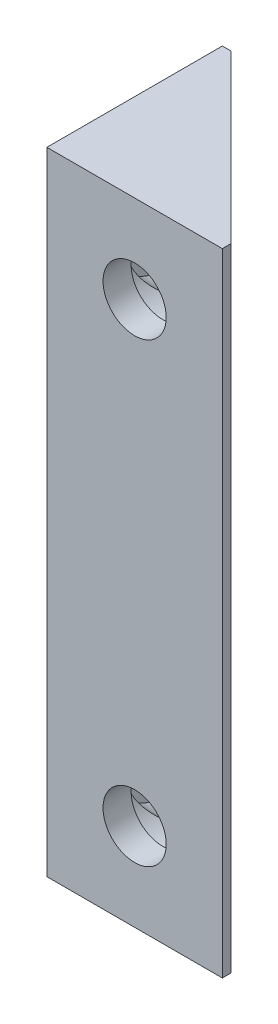
ISO-10303-21;
HEADER;
FILE_DESCRIPTION(('STEP AP214'),'2;1');
FILE_NAME('part.step','',(''),(''),'','','');
FILE_SCHEMA(('AUTOMOTIVE_DESIGN { 1 0 10303 214 1 1 1 1 }'));
ENDSEC;
DATA;
#1=APPLICATION_CONTEXT('core data for automotive mechanical design processes');
#2=APPLICATION_PROTOCOL_DEFINITION('international standard','automotive_design',2000,#1);
#3=PRODUCT_CONTEXT('',#1,'mechanical');
#4=PRODUCT('Part','Part','',(#3));
#5=PRODUCT_RELATED_PRODUCT_CATEGORY('part','',(#4));
#6=PRODUCT_DEFINITION_FORMATION('','',#4);
#7=PRODUCT_DEFINITION_CONTEXT('part definition',#1,'design');
#8=PRODUCT_DEFINITION('design','',#6,#7);
#9=PRODUCT_DEFINITION_SHAPE('','',#8);
#10=(LENGTH_UNIT() NAMED_UNIT(*) SI_UNIT(.MILLI.,.METRE.));
#11=(NAMED_UNIT(*) PLANE_ANGLE_UNIT() SI_UNIT($,.RADIAN.));
#12=(NAMED_UNIT(*) SI_UNIT($,.STERADIAN.) SOLID_ANGLE_UNIT());
#13=UNCERTAINTY_MEASURE_WITH_UNIT(LENGTH_MEASURE(1.E-05),#10,'distance_accuracy_value','');
#14=(GEOMETRIC_REPRESENTATION_CONTEXT(3) GLOBAL_UNCERTAINTY_ASSIGNED_CONTEXT((#13)) GLOBAL_UNIT_ASSIGNED_CONTEXT((#10,
#11,#12)) REPRESENTATION_CONTEXT('',''));
#15=CARTESIAN_POINT('',(0.,0.,0.));
#16=DIRECTION('',(0.,0.,1.));
#17=DIRECTION('',(1.,0.,0.));
#18=AXIS2_PLACEMENT_3D('',#15,#16,#17);
#19=CARTESIAN_POINT('',(10.,-26.,-29.778174593052));
#20=DIRECTION('',(0.,0.,1.));
#21=DIRECTION('',(1.,0.,0.));
#22=AXIS2_PLACEMENT_3D('',#19,#20,#21);
#23=CYLINDRICAL_SURFACE('',#22,5.5);
#24=CARTESIAN_POINT('',(10.,-26.,-3.2));
#25=DIRECTION('',(0.,0.,1.));
#26=DIRECTION('',(-1.,0.,0.));
#27=AXIS2_PLACEMENT_3D('',#24,#25,#26);
#28=CIRCLE('',#27,5.5);
#29=CARTESIAN_POINT('',(4.5,-26.,-3.2));
#30=VERTEX_POINT('',#29);
#31=EDGE_CURVE('E149',#30,#30,#28,.T.);
#32=ORIENTED_EDGE('',*,*,#31,.T.);
#33=EDGE_LOOP('',(#32));
#34=FACE_BOUND('',#33,.T.);
#35=CARTESIAN_POINT('',(10.,-26.,-10.));
#36=DIRECTION('',(0.707106781186547,0.,0.707106781186547));
#37=DIRECTION('',(-0.707106781186547,0.,0.707106781186547));
#38=AXIS2_PLACEMENT_3D('',#35,#36,#37);
#39=ELLIPSE('',#38,7.77817459305202,5.5);
#40=CARTESIAN_POINT('',(10.,-31.5,-10.));
#41=VERTEX_POINT('',#40);
#42=CARTESIAN_POINT('',(10.,-20.5,-10.));
#43=VERTEX_POINT('',#42);
#44=EDGE_CURVE('E128',#41,#43,#39,.F.);
#45=ORIENTED_EDGE('',*,*,#44,.T.);
#46=CARTESIAN_POINT('',(10.,-26.,-10.));
#47=DIRECTION('',(-0.707106781186547,0.,0.707106781186547));
#48=DIRECTION('',(0.707106781186547,0.,0.707106781186547));
#49=AXIS2_PLACEMENT_3D('',#46,#47,#48);
#50=ELLIPSE('',#49,7.77817459305202,5.5);
#51=EDGE_CURVE('E288',#43,#41,#50,.F.);
#52=ORIENTED_EDGE('',*,*,#51,.T.);
#53=EDGE_LOOP('',(#45,#52));
#54=FACE_BOUND('',#53,.T.);
#55=ADVANCED_FACE('F41',(#34,#54),#23,.F.);
#56=CARTESIAN_POINT('',(10.,26.,-29.778174593052));
#57=DIRECTION('',(0.,0.,1.));
#58=DIRECTION('',(1.,0.,0.));
#59=AXIS2_PLACEMENT_3D('',#56,#57,#58);
#60=CYLINDRICAL_SURFACE('',#59,5.5);
#61=CARTESIAN_POINT('',(10.,26.,-3.2));
#62=DIRECTION('',(0.,0.,1.));
#63=DIRECTION('',(1.,0.,0.));
#64=AXIS2_PLACEMENT_3D('',#61,#62,#63);
#65=CIRCLE('',#64,5.5);
#66=CARTESIAN_POINT('',(15.5,26.,-3.2));
#67=VERTEX_POINT('',#66);
#68=EDGE_CURVE('E133',#67,#67,#65,.T.);
#69=ORIENTED_EDGE('',*,*,#68,.T.);
#70=EDGE_LOOP('',(#69));
#71=FACE_BOUND('',#70,.T.);
#72=CARTESIAN_POINT('',(10.,26.,-10.));
#73=DIRECTION('',(0.707106781186547,0.,0.707106781186547));
#74=DIRECTION('',(-0.707106781186547,0.,0.707106781186547));
#75=AXIS2_PLACEMENT_3D('',#72,#73,#74);
#76=ELLIPSE('',#75,7.77817459305202,5.5);
#77=CARTESIAN_POINT('',(10.,20.5,-10.));
#78=VERTEX_POINT('',#77);
#79=CARTESIAN_POINT('',(10.,31.5,-10.));
#80=VERTEX_POINT('',#79);
#81=EDGE_CURVE('E62',#78,#80,#76,.F.);
#82=ORIENTED_EDGE('',*,*,#81,.T.);
#83=CARTESIAN_POINT('',(10.,26.,-10.));
#84=DIRECTION('',(-0.707106781186547,0.,0.707106781186547));
#85=DIRECTION('',(0.707106781186547,0.,0.707106781186547));
#86=AXIS2_PLACEMENT_3D('',#83,#84,#85);
#87=ELLIPSE('',#86,7.77817459305202,5.5);
#88=EDGE_CURVE('E11',#80,#78,#87,.F.);
#89=ORIENTED_EDGE('',*,*,#88,.T.);
#90=EDGE_LOOP('',(#82,#89));
#91=FACE_BOUND('',#90,.T.);
#92=ADVANCED_FACE('F197',(#71,#91),#60,.F.);
#93=CARTESIAN_POINT('',(23.2911688245431,-26.,-10.));
#94=DIRECTION('',(-1.,0.,0.));
#95=DIRECTION('',(0.,0.,1.));
#96=AXIS2_PLACEMENT_3D('',#93,#94,#95);
#97=CYLINDRICAL_SURFACE('',#96,3.6);
#98=CARTESIAN_POINT('',(0.,-26.,-10.));
#99=DIRECTION('',(-1.,0.,0.));
#100=DIRECTION('',(0.,0.,1.));
#101=AXIS2_PLACEMENT_3D('',#98,#99,#100);
#102=CIRCLE('',#101,3.6);
#103=CARTESIAN_POINT('',(0.,-26.,-6.4));
#104=VERTEX_POINT('',#103);
#105=EDGE_CURVE('E143',#104,#104,#102,.F.);
#106=CARTESIAN_POINT('',(3.2,-26.,-10.));
#107=DIRECTION('',(-1.,0.,0.));
#108=DIRECTION('',(0.,0.,-1.));
#109=AXIS2_PLACEMENT_3D('',#106,#107,#108);
#110=CIRCLE('',#109,3.6);
#111=CARTESIAN_POINT('',(3.2,-26.,-6.4));
#112=VERTEX_POINT('',#111);
#113=EDGE_CURVE('E309',#112,#112,#110,.T.);
#114=CARTESIAN_POINT('',(0.,-26.,-6.4));
#115=CARTESIAN_POINT('',(0.0333333333333366,-26.,-6.4));
#116=CARTESIAN_POINT('',(0.0666666666666697,-26.,-6.4));
#117=CARTESIAN_POINT('',(0.133333333333336,-26.,-6.4));
#118=CARTESIAN_POINT('',(0.166666666666669,-26.,-6.4));
#119=CARTESIAN_POINT('',(0.233333333333335,-26.,-6.4));
#120=CARTESIAN_POINT('',(0.266666666666668,-26.,-6.4));
#121=CARTESIAN_POINT('',(0.333333333333335,-26.,-6.4));
#122=CARTESIAN_POINT('',(0.366666666666668,-26.,-6.4));
#123=CARTESIAN_POINT('',(0.433333333333335,-26.,-6.4));
#124=CARTESIAN_POINT('',(0.46666666666667,-26.,-6.4));
#125=CARTESIAN_POINT('',(0.533333333333337,-26.,-6.4));
#126=CARTESIAN_POINT('',(0.56666666666667,-26.,-6.4));
#127=CARTESIAN_POINT('',(0.633333333333336,-26.,-6.4));
#128=CARTESIAN_POINT('',(0.66666666666667,-26.,-6.4));
#129=CARTESIAN_POINT('',(0.733333333333336,-26.,-6.4));
#130=CARTESIAN_POINT('',(0.766666666666669,-26.,-6.4));
#131=CARTESIAN_POINT('',(0.833333333333335,-26.,-6.4));
#132=CARTESIAN_POINT('',(0.866666666666668,-26.,-6.4));
#133=CARTESIAN_POINT('',(0.933333333333335,-26.,-6.4));
#134=CARTESIAN_POINT('',(0.966666666666668,-26.,-6.4));
#135=CARTESIAN_POINT('',(1.03333333333333,-26.,-6.4));
#136=CARTESIAN_POINT('',(1.06666666666667,-26.,-6.4));
#137=CARTESIAN_POINT('',(1.13333333333333,-26.,-6.4));
#138=CARTESIAN_POINT('',(1.16666666666667,-26.,-6.4));
#139=CARTESIAN_POINT('',(1.23333333333334,-26.,-6.4));
#140=CARTESIAN_POINT('',(1.26666666666667,-26.,-6.4));
#141=CARTESIAN_POINT('',(1.33333333333334,-26.,-6.4));
#142=CARTESIAN_POINT('',(1.36666666666667,-26.,-6.4));
#143=CARTESIAN_POINT('',(1.43333333333334,-26.,-6.4));
#144=CARTESIAN_POINT('',(1.46666666666667,-26.,-6.4));
#145=CARTESIAN_POINT('',(1.53333333333333,-26.,-6.4));
#146=CARTESIAN_POINT('',(1.56666666666667,-26.,-6.4));
#147=CARTESIAN_POINT('',(1.63333333333333,-26.,-6.4));
#148=CARTESIAN_POINT('',(1.66666666666667,-26.,-6.4));
#149=CARTESIAN_POINT('',(1.73333333333333,-26.,-6.4));
#150=CARTESIAN_POINT('',(1.76666666666667,-26.,-6.4));
#151=CARTESIAN_POINT('',(1.83333333333333,-26.,-6.4));
#152=CARTESIAN_POINT('',(1.86666666666667,-26.,-6.4));
#153=CARTESIAN_POINT('',(1.93333333333333,-26.,-6.4));
#154=CARTESIAN_POINT('',(1.96666666666667,-26.,-6.4));
#155=CARTESIAN_POINT('',(2.03333333333333,-26.,-6.4));
#156=CARTESIAN_POINT('',(2.06666666666667,-26.,-6.4));
#157=CARTESIAN_POINT('',(2.13333333333333,-26.,-6.4));
#158=CARTESIAN_POINT('',(2.16666666666667,-26.,-6.4));
#159=CARTESIAN_POINT('',(2.23333333333333,-26.,-6.4));
#160=CARTESIAN_POINT('',(2.26666666666667,-26.,-6.4));
#161=CARTESIAN_POINT('',(2.33333333333333,-26.,-6.4));
#162=CARTESIAN_POINT('',(2.36666666666667,-26.,-6.4));
#163=CARTESIAN_POINT('',(2.43333333333333,-26.,-6.4));
#164=CARTESIAN_POINT('',(2.46666666666667,-26.,-6.4));
#165=CARTESIAN_POINT('',(2.53333333333333,-26.,-6.4));
#166=CARTESIAN_POINT('',(2.56666666666667,-26.,-6.4));
#167=CARTESIAN_POINT('',(2.63333333333333,-26.,-6.4));
#168=CARTESIAN_POINT('',(2.66666666666666,-26.,-6.4));
#169=CARTESIAN_POINT('',(2.73333333333333,-26.,-6.4));
#170=CARTESIAN_POINT('',(2.76666666666667,-26.,-6.4));
#171=CARTESIAN_POINT('',(2.83333333333333,-26.,-6.4));
#172=CARTESIAN_POINT('',(2.86666666666667,-26.,-6.4));
#173=CARTESIAN_POINT('',(2.93333333333333,-26.,-6.4));
#174=CARTESIAN_POINT('',(2.96666666666667,-26.,-6.4));
#175=CARTESIAN_POINT('',(3.03333333333333,-26.,-6.4));
#176=CARTESIAN_POINT('',(3.06666666666667,-26.,-6.4));
#177=CARTESIAN_POINT('',(3.13333333333333,-26.,-6.4));
#178=CARTESIAN_POINT('',(3.16666666666666,-26.,-6.4));
#179=CARTESIAN_POINT('',(3.2,-26.,-6.4));
#180=B_SPLINE_CURVE_WITH_KNOTS('',3,(#114,#115,#116,#117,#118,#119,#120,#121,#122,#123,#124,
#125,#126,#127,#128,#129,#130,#131,#132,#133,#134,#135,#136,#137,#138,#139,#140,#141,#142,#143,
#144,#145,#146,#147,#148,#149,#150,#151,#152,#153,#154,#155,#156,#157,#158,#159,#160,#161,#162,
#163,#164,#165,#166,#167,#168,#169,#170,#171,#172,#173,#174,#175,#176,#177,#178,#179),
.UNSPECIFIED.,.F.,.F.,(4,2,2,2,2,2,2,2,2,2,2,2,2,2,2,2,2,2,2,2,2,2,2,2,2,2,2,2,2,2,2,2,4),(0.,
0.0999999999999994,0.199999999999999,0.299999999999998,0.399999999999998,0.5,0.6,
0.699999999999999,0.799999999999999,0.899999999999998,0.999999999999997,1.1,1.2,1.3,1.4,1.5,1.6,
1.7,1.8,1.9,1.99999999999999,2.1,2.2,2.3,2.4,2.5,2.59999999999999,2.69999999999999,2.8,2.9,3.,
3.1,3.19999999999999),.UNSPECIFIED.);
#181=EDGE_CURVE('BSEAM199',#104,#112,#180,.T.);
#182=ORIENTED_EDGE('',*,*,#105,.F.);
#183=ORIENTED_EDGE('',*,*,#113,.F.);
#184=ORIENTED_EDGE('',*,*,#181,.T.);
#185=ORIENTED_EDGE('',*,*,#181,.F.);
#186=EDGE_LOOP('',(#182,#184,#183,#185));
#187=FACE_BOUND('',#186,.T.);
#188=ADVANCED_FACE('F199',(#187),#97,.F.);
#189=CARTESIAN_POINT('',(0.,36.,0.));
#190=DIRECTION('',(1.,0.,0.));
#191=DIRECTION('',(0.,0.,-1.));
#192=AXIS2_PLACEMENT_3D('',#189,#190,#191);
#193=PLANE('',#192);
#194=DIRECTION('',(0.,0.,1.));
#195=VECTOR('',#194,1.);
#196=CARTESIAN_POINT('',(0.,-36.,0.));
#197=LINE('',#196,#195);
#198=CARTESIAN_POINT('',(0.,-36.,-20.));
#199=VERTEX_POINT('',#198);
#200=CARTESIAN_POINT('',(0.,-36.,0.));
#201=VERTEX_POINT('',#200);
#202=EDGE_CURVE('E163',#199,#201,#197,.T.);
#203=ORIENTED_EDGE('',*,*,#202,.T.);
#204=DIRECTION('',(0.,-1.,0.));
#205=VECTOR('',#204,1.);
#206=CARTESIAN_POINT('',(0.,36.,0.));
#207=LINE('',#206,#205);
#208=CARTESIAN_POINT('',(0.,36.,0.));
#209=VERTEX_POINT('',#208);
#210=EDGE_CURVE('E171',#209,#201,#207,.T.);
#211=ORIENTED_EDGE('',*,*,#210,.F.);
#212=DIRECTION('',(0.,0.,1.));
#213=VECTOR('',#212,1.);
#214=CARTESIAN_POINT('',(0.,36.,0.));
#215=LINE('',#214,#213);
#216=CARTESIAN_POINT('',(0.,36.,-20.));
#217=VERTEX_POINT('',#216);
#218=EDGE_CURVE('E169',#217,#209,#215,.T.);
#219=ORIENTED_EDGE('',*,*,#218,.F.);
#220=DIRECTION('',(0.,-1.,0.));
#221=VECTOR('',#220,1.);
#222=CARTESIAN_POINT('',(0.,36.,-20.));
#223=LINE('',#222,#221);
#224=EDGE_CURVE('E183',#217,#199,#223,.T.);
#225=ORIENTED_EDGE('',*,*,#224,.T.);
#226=EDGE_LOOP('',(#203,#211,#219,#225));
#227=FACE_BOUND('',#226,.T.);
#228=ORIENTED_EDGE('',*,*,#105,.T.);
#229=EDGE_LOOP('',(#228));
#230=FACE_BOUND('',#229,.T.);
#231=CARTESIAN_POINT('',(0.,26.,-10.));
#232=DIRECTION('',(-1.,0.,0.));
#233=DIRECTION('',(0.,0.,1.));
#234=AXIS2_PLACEMENT_3D('',#231,#232,#233);
#235=CIRCLE('',#234,3.6);
#236=CARTESIAN_POINT('',(0.,26.,-6.4));
#237=VERTEX_POINT('',#236);
#238=EDGE_CURVE('E153',#237,#237,#235,.T.);
#239=ORIENTED_EDGE('',*,*,#238,.F.);
#240=EDGE_LOOP('',(#239));
#241=FACE_BOUND('',#240,.T.);
#242=ADVANCED_FACE('F206',(#227,#230,#241),#193,.F.);
#243=CARTESIAN_POINT('',(10.,-26.,-10.));
#244=DIRECTION('',(0.707106781186547,0.,0.707106781186547));
#245=DIRECTION('',(-0.707106781186547,0.,0.707106781186547));
#246=AXIS2_PLACEMENT_3D('',#243,#244,#245);
#247=ELLIPSE('',#246,7.77817459305202,5.5);
#248=CARTESIAN_POINT('',(10.5,-20.5227744249483,-10.5));
#249=VERTEX_POINT('',#248);
#250=EDGE_CURVE('E56',#249,#43,#247,.T.);
#251=ORIENTED_EDGE('',*,*,#250,.T.);
#252=CARTESIAN_POINT('',(10.,-26.,-10.));
#253=DIRECTION('',(-0.707106781186547,0.,0.707106781186547));
#254=DIRECTION('',(0.707106781186547,0.,0.707106781186547));
#255=AXIS2_PLACEMENT_3D('',#252,#253,#254);
#256=ELLIPSE('',#255,7.77817459305202,5.5);
#257=EDGE_CURVE('E298',#43,#41,#256,.T.);
#258=ORIENTED_EDGE('',*,*,#257,.T.);
#259=CARTESIAN_POINT('',(10.5,-31.4772255750517,-10.5));
#260=VERTEX_POINT('',#259);
#261=EDGE_CURVE('E292',#41,#260,#247,.T.);
#262=ORIENTED_EDGE('',*,*,#261,.T.);
#263=CARTESIAN_POINT('',(10.,-26.,-11.));
#264=DIRECTION('',(-0.707106781186547,0.,0.707106781186547));
#265=DIRECTION('',(0.707106781186548,0.,0.707106781186548));
#266=AXIS2_PLACEMENT_3D('',#263,#264,#265);
#267=ELLIPSE('',#266,7.77817459305202,5.5);
#268=EDGE_CURVE('E146',#260,#249,#267,.F.);
#269=ORIENTED_EDGE('',*,*,#268,.T.);
#270=EDGE_LOOP('',(#251,#258,#262,#269));
#271=FACE_BOUND('',#270,.T.);
#272=ADVANCED_FACE('F211',(#271),#23,.F.);
#273=CARTESIAN_POINT('',(10.,-26.,-23.2911688245431));
#274=DIRECTION('',(0.,0.,1.));
#275=DIRECTION('',(1.,0.,0.));
#276=AXIS2_PLACEMENT_3D('',#273,#274,#275);
#277=CYLINDRICAL_SURFACE('',#276,3.6);
#278=CARTESIAN_POINT('',(10.,-26.,0.));
#279=DIRECTION('',(0.,0.,-1.));
#280=DIRECTION('',(-1.,0.,0.));
#281=AXIS2_PLACEMENT_3D('',#278,#279,#280);
#282=CIRCLE('',#281,3.6);
#283=CARTESIAN_POINT('',(6.4,-26.,0.));
#284=VERTEX_POINT('',#283);
#285=EDGE_CURVE('E132',#284,#284,#282,.T.);
#286=ORIENTED_EDGE('',*,*,#285,.F.);
#287=EDGE_LOOP('',(#286));
#288=FACE_BOUND('',#287,.T.);
#289=CARTESIAN_POINT('',(10.,-26.,-3.2));
#290=DIRECTION('',(0.,0.,1.));
#291=DIRECTION('',(-1.,0.,0.));
#292=AXIS2_PLACEMENT_3D('',#289,#290,#291);
#293=CIRCLE('',#292,3.6);
#294=CARTESIAN_POINT('',(6.4,-26.,-3.2));
#295=VERTEX_POINT('',#294);
#296=EDGE_CURVE('E150',#295,#295,#293,.T.);
#297=ORIENTED_EDGE('',*,*,#296,.F.);
#298=EDGE_LOOP('',(#297));
#299=FACE_BOUND('',#298,.T.);
#300=ADVANCED_FACE('F238',(#288,#299),#277,.F.);
#301=CARTESIAN_POINT('',(20.,36.,0.));
#302=DIRECTION('',(0.,0.,-1.));
#303=DIRECTION('',(-1.,0.,0.));
#304=AXIS2_PLACEMENT_3D('',#301,#302,#303);
#305=PLANE('',#304);
#306=DIRECTION('',(1.,0.,0.));
#307=VECTOR('',#306,1.);
#308=CARTESIAN_POINT('',(20.,-36.,0.));
#309=LINE('',#308,#307);
#310=CARTESIAN_POINT('',(20.,-36.,0.));
#311=VERTEX_POINT('',#310);
#312=EDGE_CURVE('E157',#201,#311,#309,.T.);
#313=ORIENTED_EDGE('',*,*,#312,.T.);
#314=DIRECTION('',(0.,-1.,0.));
#315=VECTOR('',#314,1.);
#316=CARTESIAN_POINT('',(20.,36.,0.));
#317=LINE('',#316,#315);
#318=CARTESIAN_POINT('',(20.,36.,0.));
#319=VERTEX_POINT('',#318);
#320=EDGE_CURVE('E192',#319,#311,#317,.T.);
#321=ORIENTED_EDGE('',*,*,#320,.F.);
#322=DIRECTION('',(1.,0.,0.));
#323=VECTOR('',#322,1.);
#324=CARTESIAN_POINT('',(20.,36.,0.));
#325=LINE('',#324,#323);
#326=EDGE_CURVE('E159',#209,#319,#325,.T.);
#327=ORIENTED_EDGE('',*,*,#326,.F.);
#328=ORIENTED_EDGE('',*,*,#210,.T.);
#329=EDGE_LOOP('',(#313,#321,#327,#328));
#330=FACE_BOUND('',#329,.T.);
#331=ORIENTED_EDGE('',*,*,#285,.T.);
#332=EDGE_LOOP('',(#331));
#333=FACE_BOUND('',#332,.T.);
#334=CARTESIAN_POINT('',(10.,26.,0.));
#335=DIRECTION('',(0.,0.,1.));
#336=DIRECTION('',(1.,0.,0.));
#337=AXIS2_PLACEMENT_3D('',#334,#335,#336);
#338=CIRCLE('',#337,3.6);
#339=CARTESIAN_POINT('',(13.6,26.,0.));
#340=VERTEX_POINT('',#339);
#341=EDGE_CURVE('E136',#340,#340,#338,.T.);
#342=ORIENTED_EDGE('',*,*,#341,.F.);
#343=EDGE_LOOP('',(#342));
#344=FACE_BOUND('',#343,.T.);
#345=ADVANCED_FACE('F43',(#330,#333,#344),#305,.F.);
#346=CARTESIAN_POINT('',(1.,36.,-20.));
#347=DIRECTION('',(-0.707106781186547,0.,0.707106781186547));
#348=DIRECTION('',(0.707106781186548,0.,0.707106781186548));
#349=AXIS2_PLACEMENT_3D('',#346,#347,#348);
#350=PLANE('',#349);
#351=CARTESIAN_POINT('',(10.,26.,-11.));
#352=DIRECTION('',(-0.707106781186547,0.,0.707106781186547));
#353=DIRECTION('',(0.707106781186548,0.,0.707106781186548));
#354=AXIS2_PLACEMENT_3D('',#351,#352,#353);
#355=ELLIPSE('',#354,7.77817459305202,5.5);
#356=CARTESIAN_POINT('',(10.5,20.5227744249483,-10.5));
#357=VERTEX_POINT('',#356);
#358=CARTESIAN_POINT('',(10.5,31.4772255750517,-10.5));
#359=VERTEX_POINT('',#358);
#360=EDGE_CURVE('E127',#357,#359,#355,.F.);
#361=ORIENTED_EDGE('',*,*,#360,.F.);
#362=CARTESIAN_POINT('',(11.,26.,-10.));
#363=DIRECTION('',(-0.707106781186547,0.,0.707106781186547));
#364=DIRECTION('',(-0.707106781186548,0.,-0.707106781186548));
#365=AXIS2_PLACEMENT_3D('',#362,#363,#364);
#366=ELLIPSE('',#365,7.77817459305202,5.5);
#367=EDGE_CURVE('E116',#359,#357,#366,.F.);
#368=ORIENTED_EDGE('',*,*,#367,.F.);
#369=EDGE_LOOP('',(#361,#368));
#370=FACE_BOUND('',#369,.T.);
#371=ORIENTED_EDGE('',*,*,#268,.F.);
#372=CARTESIAN_POINT('',(11.,-26.,-10.));
#373=DIRECTION('',(-0.707106781186547,0.,0.707106781186547));
#374=DIRECTION('',(-0.707106781186548,0.,-0.707106781186548));
#375=AXIS2_PLACEMENT_3D('',#372,#373,#374);
#376=ELLIPSE('',#375,7.77817459305202,5.5);
#377=EDGE_CURVE('E312',#249,#260,#376,.F.);
#378=ORIENTED_EDGE('',*,*,#377,.F.);
#379=EDGE_LOOP('',(#371,#378));
#380=FACE_BOUND('',#379,.T.);
#381=DIRECTION('',(-0.707106781186548,0.,-0.707106781186548));
#382=VECTOR('',#381,1.);
#383=CARTESIAN_POINT('',(1.,-36.,-20.));
#384=LINE('',#383,#382);
#385=CARTESIAN_POINT('',(20.,-36.,-1.));
#386=VERTEX_POINT('',#385);
#387=CARTESIAN_POINT('',(1.,-36.,-20.));
#388=VERTEX_POINT('',#387);
#389=EDGE_CURVE('E176',#386,#388,#384,.T.);
#390=ORIENTED_EDGE('',*,*,#389,.T.);
#391=DIRECTION('',(0.,-1.,0.));
#392=VECTOR('',#391,1.);
#393=CARTESIAN_POINT('',(1.,36.,-20.));
#394=LINE('',#393,#392);
#395=CARTESIAN_POINT('',(1.,36.,-20.));
#396=VERTEX_POINT('',#395);
#397=EDGE_CURVE('E186',#396,#388,#394,.T.);
#398=ORIENTED_EDGE('',*,*,#397,.F.);
#399=DIRECTION('',(-0.707106781186548,0.,-0.707106781186548));
#400=VECTOR('',#399,1.);
#401=CARTESIAN_POINT('',(1.,36.,-20.));
#402=LINE('',#401,#400);
#403=CARTESIAN_POINT('',(20.,36.,-1.));
#404=VERTEX_POINT('',#403);
#405=EDGE_CURVE('E165',#404,#396,#402,.T.);
#406=ORIENTED_EDGE('',*,*,#405,.F.);
#407=DIRECTION('',(0.,-1.,0.));
#408=VECTOR('',#407,1.);
#409=CARTESIAN_POINT('',(20.,36.,-1.));
#410=LINE('',#409,#408);
#411=EDGE_CURVE('E189',#404,#386,#410,.T.);
#412=ORIENTED_EDGE('',*,*,#411,.T.);
#413=EDGE_LOOP('',(#390,#398,#406,#412));
#414=FACE_BOUND('',#413,.T.);
#415=ADVANCED_FACE('F125',(#370,#380,#414),#350,.F.);
#416=CARTESIAN_POINT('',(20.,36.,0.));
#417=DIRECTION('',(-1.,0.,0.));
#418=DIRECTION('',(0.,0.,1.));
#419=AXIS2_PLACEMENT_3D('',#416,#417,#418);
#420=PLANE('',#419);
#421=DIRECTION('',(0.,0.,-1.));
#422=VECTOR('',#421,1.);
#423=CARTESIAN_POINT('',(20.,-36.,0.));
#424=LINE('',#423,#422);
#425=EDGE_CURVE('E174',#311,#386,#424,.T.);
#426=ORIENTED_EDGE('',*,*,#425,.T.);
#427=ORIENTED_EDGE('',*,*,#411,.F.);
#428=DIRECTION('',(0.,0.,-1.));
#429=VECTOR('',#428,1.);
#430=CARTESIAN_POINT('',(20.,36.,0.));
#431=LINE('',#430,#429);
#432=EDGE_CURVE('E162',#319,#404,#431,.T.);
#433=ORIENTED_EDGE('',*,*,#432,.F.);
#434=ORIENTED_EDGE('',*,*,#320,.T.);
#435=EDGE_LOOP('',(#426,#427,#433,#434));
#436=FACE_BOUND('',#435,.T.);
#437=ADVANCED_FACE('F250',(#436),#420,.F.);
#438=CARTESIAN_POINT('',(0.,36.,-20.));
#439=DIRECTION('',(0.,0.,1.));
#440=DIRECTION('',(1.,0.,0.));
#441=AXIS2_PLACEMENT_3D('',#438,#439,#440);
#442=PLANE('',#441);
#443=DIRECTION('',(-1.,0.,0.));
#444=VECTOR('',#443,1.);
#445=CARTESIAN_POINT('',(0.,-36.,-20.));
#446=LINE('',#445,#444);
#447=EDGE_CURVE('E178',#388,#199,#446,.T.);
#448=ORIENTED_EDGE('',*,*,#447,.T.);
#449=ORIENTED_EDGE('',*,*,#224,.F.);
#450=DIRECTION('',(-1.,0.,0.));
#451=VECTOR('',#450,1.);
#452=CARTESIAN_POINT('',(0.,36.,-20.));
#453=LINE('',#452,#451);
#454=EDGE_CURVE('E167',#396,#217,#453,.T.);
#455=ORIENTED_EDGE('',*,*,#454,.F.);
#456=ORIENTED_EDGE('',*,*,#397,.T.);
#457=EDGE_LOOP('',(#448,#449,#455,#456));
#458=FACE_BOUND('',#457,.T.);
#459=ADVANCED_FACE('F242',(#458),#442,.F.);
#460=CARTESIAN_POINT('',(0.,36.,0.));
#461=DIRECTION('',(0.,-1.,0.));
#462=DIRECTION('',(0.,0.,-1.));
#463=AXIS2_PLACEMENT_3D('',#460,#461,#462);
#464=PLANE('',#463);
#465=ORIENTED_EDGE('',*,*,#326,.T.);
#466=ORIENTED_EDGE('',*,*,#432,.T.);
#467=ORIENTED_EDGE('',*,*,#405,.T.);
#468=ORIENTED_EDGE('',*,*,#454,.T.);
#469=ORIENTED_EDGE('',*,*,#218,.T.);
#470=EDGE_LOOP('',(#465,#466,#467,#468,#469));
#471=FACE_BOUND('',#470,.T.);
#472=ADVANCED_FACE('F232',(#471),#464,.F.);
#473=CARTESIAN_POINT('',(0.,-36.,0.));
#474=DIRECTION('',(0.,-1.,0.));
#475=DIRECTION('',(0.,0.,-1.));
#476=AXIS2_PLACEMENT_3D('',#473,#474,#475);
#477=PLANE('',#476);
#478=ORIENTED_EDGE('',*,*,#312,.F.);
#479=ORIENTED_EDGE('',*,*,#202,.F.);
#480=ORIENTED_EDGE('',*,*,#447,.F.);
#481=ORIENTED_EDGE('',*,*,#389,.F.);
#482=ORIENTED_EDGE('',*,*,#425,.F.);
#483=EDGE_LOOP('',(#478,#479,#480,#481,#482));
#484=FACE_BOUND('',#483,.T.);
#485=ADVANCED_FACE('F225',(#484),#477,.T.);
#486=CARTESIAN_POINT('',(10.,26.,-23.2911688245431));
#487=DIRECTION('',(0.,0.,1.));
#488=DIRECTION('',(1.,0.,0.));
#489=AXIS2_PLACEMENT_3D('',#486,#487,#488);
#490=CYLINDRICAL_SURFACE('',#489,3.6);
#491=CARTESIAN_POINT('',(10.,26.,-3.2));
#492=DIRECTION('',(0.,0.,1.));
#493=DIRECTION('',(1.,0.,0.));
#494=AXIS2_PLACEMENT_3D('',#491,#492,#493);
#495=CIRCLE('',#494,3.6);
#496=CARTESIAN_POINT('',(13.6,26.,-3.2));
#497=VERTEX_POINT('',#496);
#498=EDGE_CURVE('E139',#497,#497,#495,.T.);
#499=ORIENTED_EDGE('',*,*,#498,.F.);
#500=EDGE_LOOP('',(#499));
#501=FACE_BOUND('',#500,.T.);
#502=ORIENTED_EDGE('',*,*,#341,.T.);
#503=EDGE_LOOP('',(#502));
#504=FACE_BOUND('',#503,.T.);
#505=ADVANCED_FACE('F216',(#501,#504),#490,.F.);
#506=CARTESIAN_POINT('',(10.,26.,-10.));
#507=DIRECTION('',(0.707106781186547,0.,0.707106781186547));
#508=DIRECTION('',(-0.707106781186547,0.,0.707106781186547));
#509=AXIS2_PLACEMENT_3D('',#506,#507,#508);
#510=ELLIPSE('',#509,7.77817459305202,5.5);
#511=EDGE_CURVE('E113',#359,#80,#510,.T.);
#512=ORIENTED_EDGE('',*,*,#511,.T.);
#513=CARTESIAN_POINT('',(10.,26.,-10.));
#514=DIRECTION('',(-0.707106781186547,0.,0.707106781186547));
#515=DIRECTION('',(0.707106781186547,0.,0.707106781186547));
#516=AXIS2_PLACEMENT_3D('',#513,#514,#515);
#517=ELLIPSE('',#516,7.77817459305202,5.5);
#518=EDGE_CURVE('E49',#80,#78,#517,.T.);
#519=ORIENTED_EDGE('',*,*,#518,.T.);
#520=EDGE_CURVE('E121',#78,#357,#510,.T.);
#521=ORIENTED_EDGE('',*,*,#520,.T.);
#522=ORIENTED_EDGE('',*,*,#360,.T.);
#523=EDGE_LOOP('',(#512,#519,#521,#522));
#524=FACE_BOUND('',#523,.T.);
#525=ADVANCED_FACE('F131',(#524),#60,.F.);
#526=CARTESIAN_POINT('',(10.,26.,-3.2));
#527=DIRECTION('',(0.,0.,1.));
#528=DIRECTION('',(1.,0.,0.));
#529=AXIS2_PLACEMENT_3D('',#526,#527,#528);
#530=PLANE('',#529);
#531=ORIENTED_EDGE('',*,*,#498,.T.);
#532=EDGE_LOOP('',(#531));
#533=FACE_BOUND('',#532,.T.);
#534=ORIENTED_EDGE('',*,*,#68,.F.);
#535=EDGE_LOOP('',(#534));
#536=FACE_BOUND('',#535,.T.);
#537=ADVANCED_FACE('F215',(#533,#536),#530,.F.);
#538=CARTESIAN_POINT('',(10.,-26.,-3.2));
#539=DIRECTION('',(0.,0.,-1.));
#540=DIRECTION('',(-1.,0.,0.));
#541=AXIS2_PLACEMENT_3D('',#538,#539,#540);
#542=PLANE('',#541);
#543=ORIENTED_EDGE('',*,*,#296,.T.);
#544=EDGE_LOOP('',(#543));
#545=FACE_BOUND('',#544,.T.);
#546=ORIENTED_EDGE('',*,*,#31,.F.);
#547=EDGE_LOOP('',(#546));
#548=FACE_BOUND('',#547,.T.);
#549=ADVANCED_FACE('F222',(#545,#548),#542,.T.);
#550=CARTESIAN_POINT('',(23.2911688245431,26.,-10.));
#551=DIRECTION('',(-1.,0.,0.));
#552=DIRECTION('',(0.,0.,1.));
#553=AXIS2_PLACEMENT_3D('',#550,#551,#552);
#554=CYLINDRICAL_SURFACE('',#553,3.6);
#555=CARTESIAN_POINT('',(3.2,26.,-10.));
#556=DIRECTION('',(-1.,0.,0.));
#557=DIRECTION('',(0.,0.,1.));
#558=AXIS2_PLACEMENT_3D('',#555,#556,#557);
#559=CIRCLE('',#558,3.6);
#560=CARTESIAN_POINT('',(3.2,26.,-6.4));
#561=VERTEX_POINT('',#560);
#562=EDGE_CURVE('E315',#561,#561,#559,.T.);
#563=CARTESIAN_POINT('',(3.2,26.,-6.4));
#564=CARTESIAN_POINT('',(3.16666666666666,26.,-6.4));
#565=CARTESIAN_POINT('',(3.13333333333333,26.,-6.4));
#566=CARTESIAN_POINT('',(3.06666666666667,26.,-6.4));
#567=CARTESIAN_POINT('',(3.03333333333333,26.,-6.4));
#568=CARTESIAN_POINT('',(2.96666666666667,26.,-6.4));
#569=CARTESIAN_POINT('',(2.93333333333333,26.,-6.4));
#570=CARTESIAN_POINT('',(2.86666666666667,26.,-6.4));
#571=CARTESIAN_POINT('',(2.83333333333333,26.,-6.4));
#572=CARTESIAN_POINT('',(2.76666666666667,26.,-6.4));
#573=CARTESIAN_POINT('',(2.73333333333333,26.,-6.4));
#574=CARTESIAN_POINT('',(2.66666666666666,26.,-6.4));
#575=CARTESIAN_POINT('',(2.63333333333333,26.,-6.4));
#576=CARTESIAN_POINT('',(2.56666666666667,26.,-6.4));
#577=CARTESIAN_POINT('',(2.53333333333333,26.,-6.4));
#578=CARTESIAN_POINT('',(2.46666666666667,26.,-6.4));
#579=CARTESIAN_POINT('',(2.43333333333333,26.,-6.4));
#580=CARTESIAN_POINT('',(2.36666666666667,26.,-6.4));
#581=CARTESIAN_POINT('',(2.33333333333333,26.,-6.4));
#582=CARTESIAN_POINT('',(2.26666666666667,26.,-6.4));
#583=CARTESIAN_POINT('',(2.23333333333333,26.,-6.4));
#584=CARTESIAN_POINT('',(2.16666666666667,26.,-6.4));
#585=CARTESIAN_POINT('',(2.13333333333333,26.,-6.4));
#586=CARTESIAN_POINT('',(2.06666666666667,26.,-6.4));
#587=CARTESIAN_POINT('',(2.03333333333333,26.,-6.4));
#588=CARTESIAN_POINT('',(1.96666666666667,26.,-6.4));
#589=CARTESIAN_POINT('',(1.93333333333333,26.,-6.4));
#590=CARTESIAN_POINT('',(1.86666666666667,26.,-6.4));
#591=CARTESIAN_POINT('',(1.83333333333333,26.,-6.4));
#592=CARTESIAN_POINT('',(1.76666666666667,26.,-6.4));
#593=CARTESIAN_POINT('',(1.73333333333333,26.,-6.4));
#594=CARTESIAN_POINT('',(1.66666666666667,26.,-6.4));
#595=CARTESIAN_POINT('',(1.63333333333333,26.,-6.4));
#596=CARTESIAN_POINT('',(1.56666666666667,26.,-6.4));
#597=CARTESIAN_POINT('',(1.53333333333333,26.,-6.4));
#598=CARTESIAN_POINT('',(1.46666666666667,26.,-6.4));
#599=CARTESIAN_POINT('',(1.43333333333334,26.,-6.4));
#600=CARTESIAN_POINT('',(1.36666666666667,26.,-6.4));
#601=CARTESIAN_POINT('',(1.33333333333334,26.,-6.4));
#602=CARTESIAN_POINT('',(1.26666666666667,26.,-6.4));
#603=CARTESIAN_POINT('',(1.23333333333334,26.,-6.4));
#604=CARTESIAN_POINT('',(1.16666666666667,26.,-6.4));
#605=CARTESIAN_POINT('',(1.13333333333333,26.,-6.4));
#606=CARTESIAN_POINT('',(1.06666666666667,26.,-6.4));
#607=CARTESIAN_POINT('',(1.03333333333333,26.,-6.4));
#608=CARTESIAN_POINT('',(0.966666666666668,26.,-6.4));
#609=CARTESIAN_POINT('',(0.933333333333335,26.,-6.4));
#610=CARTESIAN_POINT('',(0.866666666666668,26.,-6.4));
#611=CARTESIAN_POINT('',(0.833333333333335,26.,-6.4));
#612=CARTESIAN_POINT('',(0.766666666666669,26.,-6.4));
#613=CARTESIAN_POINT('',(0.733333333333336,26.,-6.4));
#614=CARTESIAN_POINT('',(0.66666666666667,26.,-6.4));
#615=CARTESIAN_POINT('',(0.633333333333336,26.,-6.4));
#616=CARTESIAN_POINT('',(0.56666666666667,26.,-6.4));
#617=CARTESIAN_POINT('',(0.533333333333337,26.,-6.4));
#618=CARTESIAN_POINT('',(0.46666666666667,26.,-6.4));
#619=CARTESIAN_POINT('',(0.433333333333335,26.,-6.4));
#620=CARTESIAN_POINT('',(0.366666666666668,26.,-6.4));
#621=CARTESIAN_POINT('',(0.333333333333335,26.,-6.4));
#622=CARTESIAN_POINT('',(0.266666666666668,26.,-6.4));
#623=CARTESIAN_POINT('',(0.233333333333335,26.,-6.4));
#624=CARTESIAN_POINT('',(0.166666666666669,26.,-6.4));
#625=CARTESIAN_POINT('',(0.133333333333336,26.,-6.4));
#626=CARTESIAN_POINT('',(0.0666666666666697,26.,-6.4));
#627=CARTESIAN_POINT('',(0.0333333333333366,26.,-6.4));
#628=CARTESIAN_POINT('',(0.,26.,-6.4));
#629=B_SPLINE_CURVE_WITH_KNOTS('',3,(#563,#564,#565,#566,#567,#568,#569,#570,#571,#572,#573,
#574,#575,#576,#577,#578,#579,#580,#581,#582,#583,#584,#585,#586,#587,#588,#589,#590,#591,#592,
#593,#594,#595,#596,#597,#598,#599,#600,#601,#602,#603,#604,#605,#606,#607,#608,#609,#610,#611,
#612,#613,#614,#615,#616,#617,#618,#619,#620,#621,#622,#623,#624,#625,#626,#627,#628),
.UNSPECIFIED.,.F.,.F.,(4,2,2,2,2,2,2,2,2,2,2,2,2,2,2,2,2,2,2,2,2,2,2,2,2,2,2,2,2,2,2,2,4),(0.,
0.0999999999999994,0.199999999999999,0.299999999999998,0.399999999999998,0.5,0.6,
0.699999999999999,0.799999999999999,0.899999999999998,0.999999999999997,1.1,1.2,1.3,1.4,1.5,1.6,
1.7,1.8,1.9,1.99999999999999,2.1,2.2,2.3,2.4,2.5,2.59999999999999,2.69999999999999,2.8,2.9,3.,
3.1,3.19999999999999),.UNSPECIFIED.);
#630=EDGE_CURVE('BSEAM282',#561,#237,#629,.T.);
#631=ORIENTED_EDGE('',*,*,#562,.F.);
#632=ORIENTED_EDGE('',*,*,#238,.T.);
#633=ORIENTED_EDGE('',*,*,#630,.T.);
#634=ORIENTED_EDGE('',*,*,#630,.F.);
#635=EDGE_LOOP('',(#631,#633,#632,#634));
#636=FACE_BOUND('',#635,.T.);
#637=ADVANCED_FACE('F282',(#636),#554,.F.);
#638=CARTESIAN_POINT('',(3.2,26.,-10.));
#639=DIRECTION('',(-1.,0.,0.));
#640=DIRECTION('',(0.,0.,1.));
#641=AXIS2_PLACEMENT_3D('',#638,#639,#640);
#642=PLANE('',#641);
#643=ORIENTED_EDGE('',*,*,#562,.T.);
#644=EDGE_LOOP('',(#643));
#645=FACE_BOUND('',#644,.T.);
#646=CARTESIAN_POINT('',(3.2,26.,-10.));
#647=DIRECTION('',(-1.,0.,0.));
#648=DIRECTION('',(0.,0.,1.));
#649=AXIS2_PLACEMENT_3D('',#646,#647,#648);
#650=CIRCLE('',#649,5.5);
#651=CARTESIAN_POINT('',(3.2,26.,-4.5));
#652=VERTEX_POINT('',#651);
#653=EDGE_CURVE('E129',#652,#652,#650,.T.);
#654=ORIENTED_EDGE('',*,*,#653,.F.);
#655=EDGE_LOOP('',(#654));
#656=FACE_BOUND('',#655,.T.);
#657=ADVANCED_FACE('F321',(#645,#656),#642,.F.);
#658=CARTESIAN_POINT('',(29.778174593052,26.,-10.));
#659=DIRECTION('',(-1.,0.,0.));
#660=DIRECTION('',(0.,0.,1.));
#661=AXIS2_PLACEMENT_3D('',#658,#659,#660);
#662=CYLINDRICAL_SURFACE('',#661,5.5);
#663=ORIENTED_EDGE('',*,*,#653,.T.);
#664=EDGE_LOOP('',(#663));
#665=FACE_BOUND('',#664,.T.);
#666=ORIENTED_EDGE('',*,*,#81,.F.);
#667=ORIENTED_EDGE('',*,*,#518,.F.);
#668=EDGE_LOOP('',(#666,#667));
#669=FACE_BOUND('',#668,.T.);
#670=ADVANCED_FACE('F196',(#665,#669),#662,.F.);
#671=CARTESIAN_POINT('',(3.2,-26.,-10.));
#672=DIRECTION('',(1.,0.,0.));
#673=DIRECTION('',(0.,0.,-1.));
#674=AXIS2_PLACEMENT_3D('',#671,#672,#673);
#675=PLANE('',#674);
#676=ORIENTED_EDGE('',*,*,#113,.T.);
#677=EDGE_LOOP('',(#676));
#678=FACE_BOUND('',#677,.T.);
#679=CARTESIAN_POINT('',(3.2,-26.,-10.));
#680=DIRECTION('',(-1.,0.,0.));
#681=DIRECTION('',(0.,0.,-1.));
#682=AXIS2_PLACEMENT_3D('',#679,#680,#681);
#683=CIRCLE('',#682,5.5);
#684=CARTESIAN_POINT('',(3.2,-26.,-15.5));
#685=VERTEX_POINT('',#684);
#686=EDGE_CURVE('E295',#685,#685,#683,.T.);
#687=ORIENTED_EDGE('',*,*,#686,.F.);
#688=EDGE_LOOP('',(#687));
#689=FACE_BOUND('',#688,.T.);
#690=ADVANCED_FACE('F335',(#678,#689),#675,.T.);
#691=CARTESIAN_POINT('',(29.778174593052,-26.,-10.));
#692=DIRECTION('',(-1.,0.,0.));
#693=DIRECTION('',(0.,0.,1.));
#694=AXIS2_PLACEMENT_3D('',#691,#692,#693);
#695=CYLINDRICAL_SURFACE('',#694,5.5);
#696=ORIENTED_EDGE('',*,*,#686,.T.);
#697=EDGE_LOOP('',(#696));
#698=FACE_BOUND('',#697,.T.);
#699=ORIENTED_EDGE('',*,*,#44,.F.);
#700=ORIENTED_EDGE('',*,*,#257,.F.);
#701=EDGE_LOOP('',(#699,#700));
#702=FACE_BOUND('',#701,.T.);
#703=ADVANCED_FACE('F334',(#698,#702),#695,.F.);
#704=ORIENTED_EDGE('',*,*,#511,.F.);
#705=ORIENTED_EDGE('',*,*,#367,.T.);
#706=ORIENTED_EDGE('',*,*,#520,.F.);
#707=ORIENTED_EDGE('',*,*,#88,.F.);
#708=EDGE_LOOP('',(#704,#705,#706,#707));
#709=FACE_BOUND('',#708,.T.);
#710=ADVANCED_FACE('F115',(#709),#662,.F.);
#711=ORIENTED_EDGE('',*,*,#250,.F.);
#712=ORIENTED_EDGE('',*,*,#377,.T.);
#713=ORIENTED_EDGE('',*,*,#261,.F.);
#714=ORIENTED_EDGE('',*,*,#51,.F.);
#715=EDGE_LOOP('',(#711,#712,#713,#714));
#716=FACE_BOUND('',#715,.T.);
#717=ADVANCED_FACE('F330',(#716),#695,.F.);
#718=CLOSED_SHELL('',(#55,#92,#188,#242,#272,#300,#345,#415,#437,#459,#472,#485,#505,#525,#537,
#549,#637,#657,#670,#690,#703,#710,#717));
#719=MANIFOLD_SOLID_BREP('B2',#718);
#720=ADVANCED_BREP_SHAPE_REPRESENTATION('',(#18,#719),#14);
#721=SHAPE_DEFINITION_REPRESENTATION(#9,#720);
ENDSEC;
END-ISO-10303-21;
